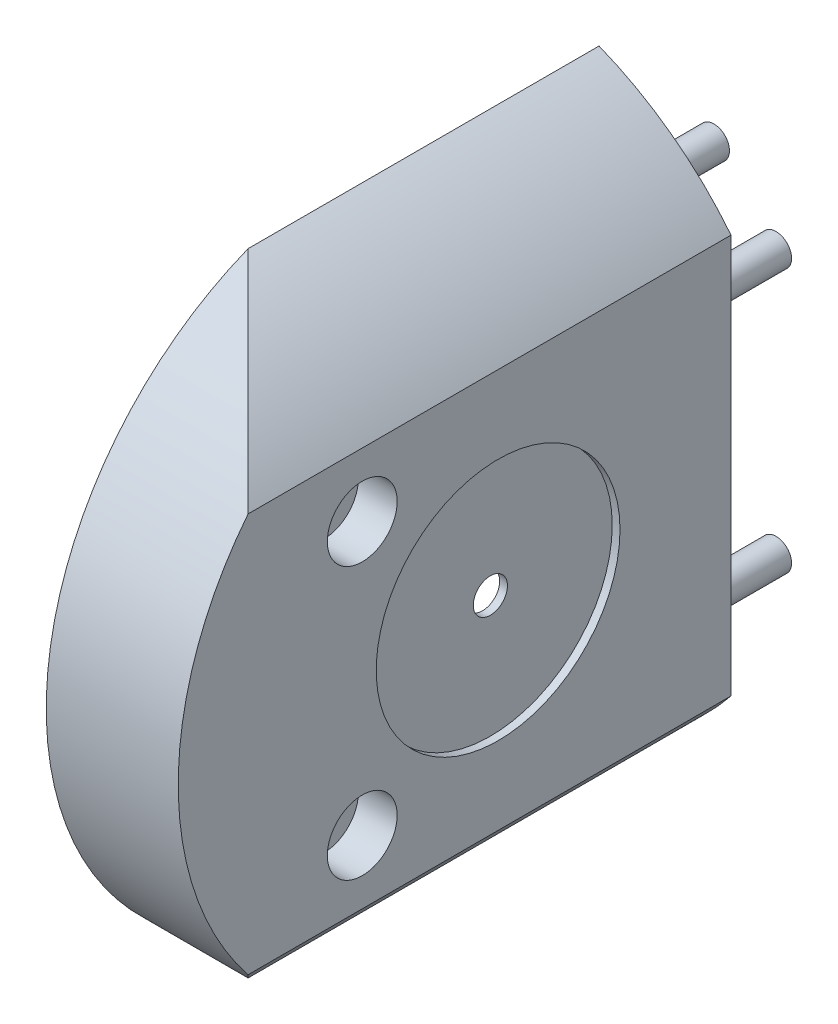
ISO-10303-21;
HEADER;
FILE_DESCRIPTION(('STEP AP214'),'2;1');
FILE_NAME('part.step','',(''),(''),'','','');
FILE_SCHEMA(('AUTOMOTIVE_DESIGN { 1 0 10303 214 1 1 1 1 }'));
ENDSEC;
DATA;
#1=APPLICATION_CONTEXT('core data for automotive mechanical design processes');
#2=APPLICATION_PROTOCOL_DEFINITION('international standard','automotive_design',2000,#1);
#3=PRODUCT_CONTEXT('',#1,'mechanical');
#4=PRODUCT('Part','Part','',(#3));
#5=PRODUCT_RELATED_PRODUCT_CATEGORY('part','',(#4));
#6=PRODUCT_DEFINITION_FORMATION('','',#4);
#7=PRODUCT_DEFINITION_CONTEXT('part definition',#1,'design');
#8=PRODUCT_DEFINITION('design','',#6,#7);
#9=PRODUCT_DEFINITION_SHAPE('','',#8);
#10=(LENGTH_UNIT() NAMED_UNIT(*) SI_UNIT(.MILLI.,.METRE.));
#11=(NAMED_UNIT(*) PLANE_ANGLE_UNIT() SI_UNIT($,.RADIAN.));
#12=(NAMED_UNIT(*) SI_UNIT($,.STERADIAN.) SOLID_ANGLE_UNIT());
#13=UNCERTAINTY_MEASURE_WITH_UNIT(LENGTH_MEASURE(1.E-05),#10,'distance_accuracy_value','');
#14=(GEOMETRIC_REPRESENTATION_CONTEXT(3) GLOBAL_UNCERTAINTY_ASSIGNED_CONTEXT((#13)) GLOBAL_UNIT_ASSIGNED_CONTEXT((#10,
#11,#12)) REPRESENTATION_CONTEXT('',''));
#15=CARTESIAN_POINT('',(0.,0.,0.));
#16=DIRECTION('',(0.,0.,1.));
#17=DIRECTION('',(1.,0.,0.));
#18=AXIS2_PLACEMENT_3D('',#15,#16,#17);
#19=CARTESIAN_POINT('',(15.2,41.2,30.));
#20=DIRECTION('',(1.,0.,0.));
#21=DIRECTION('',(0.,1.,0.));
#22=AXIS2_PLACEMENT_3D('',#19,#20,#21);
#23=PLANE('',#22);
#24=CARTESIAN_POINT('',(15.2,17.5,47.5));
#25=DIRECTION('',(1.,0.,0.));
#26=DIRECTION('',(0.,0.,-1.));
#27=AXIS2_PLACEMENT_3D('',#24,#25,#26);
#28=CIRCLE('',#27,2.);
#29=CARTESIAN_POINT('',(15.2,17.5,45.5));
#30=VERTEX_POINT('',#29);
#31=EDGE_CURVE('E228',#30,#30,#28,.T.);
#32=ORIENTED_EDGE('',*,*,#31,.T.);
#33=EDGE_LOOP('',(#32));
#34=FACE_BOUND('',#33,.T.);
#35=CARTESIAN_POINT('',(15.2,-17.5,47.5));
#36=DIRECTION('',(1.,0.,0.));
#37=DIRECTION('',(0.,0.,-1.));
#38=AXIS2_PLACEMENT_3D('',#35,#36,#37);
#39=CIRCLE('',#38,2.);
#40=CARTESIAN_POINT('',(15.2,-17.5,45.5));
#41=VERTEX_POINT('',#40);
#42=EDGE_CURVE('E231',#41,#41,#39,.T.);
#43=ORIENTED_EDGE('',*,*,#42,.T.);
#44=EDGE_LOOP('',(#43));
#45=FACE_BOUND('',#44,.T.);
#46=DIRECTION('',(0.,0.,-1.));
#47=VECTOR('',#46,1.);
#48=CARTESIAN_POINT('',(15.2,24.9319072675959,30.));
#49=LINE('',#48,#47);
#50=CARTESIAN_POINT('',(15.2,24.9319072675959,30.));
#51=VERTEX_POINT('',#50);
#52=CARTESIAN_POINT('',(15.2,24.9319072675959,0.));
#53=VERTEX_POINT('',#52);
#54=EDGE_CURVE('E232',#51,#53,#49,.T.);
#55=ORIENTED_EDGE('',*,*,#54,.F.);
#56=DIRECTION('',(0.,-1.,0.));
#57=VECTOR('',#56,1.);
#58=CARTESIAN_POINT('',(15.2,41.2,30.));
#59=LINE('',#58,#57);
#60=CARTESIAN_POINT('',(15.2,20.,30.));
#61=VERTEX_POINT('',#60);
#62=EDGE_CURVE('E111',#51,#61,#59,.T.);
#63=ORIENTED_EDGE('',*,*,#62,.T.);
#64=CARTESIAN_POINT('',(15.2,0.,30.));
#65=DIRECTION('',(-1.,0.,0.));
#66=DIRECTION('',(0.,-1.,0.));
#67=AXIS2_PLACEMENT_3D('',#64,#65,#66);
#68=CIRCLE('',#67,20.);
#69=CARTESIAN_POINT('',(15.2,-20.,30.));
#70=VERTEX_POINT('',#69);
#71=EDGE_CURVE('E116',#70,#61,#68,.T.);
#72=ORIENTED_EDGE('',*,*,#71,.F.);
#73=CARTESIAN_POINT('',(15.2,-24.9319072675959,30.));
#74=VERTEX_POINT('',#73);
#75=EDGE_CURVE('E49',#70,#74,#59,.T.);
#76=ORIENTED_EDGE('',*,*,#75,.T.);
#77=DIRECTION('',(0.,0.,-1.));
#78=VECTOR('',#77,1.);
#79=CARTESIAN_POINT('',(15.2,-24.9319072675959,30.));
#80=LINE('',#79,#78);
#81=CARTESIAN_POINT('',(15.2,-24.9319072675959,0.));
#82=VERTEX_POINT('',#81);
#83=EDGE_CURVE('E235',#82,#74,#80,.F.);
#84=ORIENTED_EDGE('',*,*,#83,.F.);
#85=DIRECTION('',(0.,-1.,0.));
#86=VECTOR('',#85,1.);
#87=CARTESIAN_POINT('',(15.2,41.2,0.));
#88=LINE('',#87,#86);
#89=CARTESIAN_POINT('',(15.2,-38.2936025988676,0.));
#90=VERTEX_POINT('',#89);
#91=EDGE_CURVE('E157',#82,#90,#88,.T.);
#92=ORIENTED_EDGE('',*,*,#91,.T.);
#93=DIRECTION('',(0.,0.,-1.));
#94=VECTOR('',#93,1.);
#95=CARTESIAN_POINT('',(15.2,-38.2936025988676,71.2));
#96=LINE('',#95,#94);
#97=CARTESIAN_POINT('',(15.2,-38.2936025988676,45.2));
#98=VERTEX_POINT('',#97);
#99=EDGE_CURVE('E144',#90,#98,#96,.F.);
#100=ORIENTED_EDGE('',*,*,#99,.T.);
#101=CARTESIAN_POINT('',(15.2,0.,30.));
#102=DIRECTION('',(-1.,0.,0.));
#103=DIRECTION('',(0.,-1.,0.));
#104=AXIS2_PLACEMENT_3D('',#101,#102,#103);
#105=CIRCLE('',#104,41.2);
#106=CARTESIAN_POINT('',(15.2,38.2936025988676,45.2));
#107=VERTEX_POINT('',#106);
#108=EDGE_CURVE('E153',#98,#107,#105,.T.);
#109=ORIENTED_EDGE('',*,*,#108,.T.);
#110=DIRECTION('',(0.,0.,-1.));
#111=VECTOR('',#110,1.);
#112=CARTESIAN_POINT('',(15.2,38.2936025988676,71.2));
#113=LINE('',#112,#111);
#114=CARTESIAN_POINT('',(15.2,38.2936025988676,0.));
#115=VERTEX_POINT('',#114);
#116=EDGE_CURVE('E150',#107,#115,#113,.T.);
#117=ORIENTED_EDGE('',*,*,#116,.T.);
#118=EDGE_CURVE('E160',#115,#53,#88,.T.);
#119=ORIENTED_EDGE('',*,*,#118,.T.);
#120=EDGE_LOOP('',(#55,#63,#72,#76,#84,#92,#100,#109,#117,#119));
#121=FACE_BOUND('',#120,.T.);
#122=ADVANCED_FACE('F35',(#34,#45,#121),#23,.F.);
#123=CARTESIAN_POINT('',(0.,0.,0.));
#124=DIRECTION('',(0.,0.,-1.));
#125=DIRECTION('',(-1.,0.,0.));
#126=AXIS2_PLACEMENT_3D('',#123,#124,#125);
#127=PLANE('',#126);
#128=CARTESIAN_POINT('',(28.,-17.,0.));
#129=DIRECTION('',(0.,0.,-1.));
#130=DIRECTION('',(-1.,0.,0.));
#131=AXIS2_PLACEMENT_3D('',#128,#129,#130);
#132=CIRCLE('',#131,2.);
#133=CARTESIAN_POINT('',(26.,-17.,0.));
#134=VERTEX_POINT('',#133);
#135=EDGE_CURVE('E178',#134,#134,#132,.T.);
#136=ORIENTED_EDGE('',*,*,#135,.F.);
#137=EDGE_LOOP('',(#136));
#138=FACE_BOUND('',#137,.T.);
#139=CARTESIAN_POINT('',(20.,-25.,0.));
#140=DIRECTION('',(0.,0.,-1.));
#141=DIRECTION('',(-1.,0.,0.));
#142=AXIS2_PLACEMENT_3D('',#139,#140,#141);
#143=CIRCLE('',#142,2.00000000000001);
#144=CARTESIAN_POINT('',(18.,-25.,0.));
#145=VERTEX_POINT('',#144);
#146=EDGE_CURVE('E175',#145,#145,#143,.T.);
#147=ORIENTED_EDGE('',*,*,#146,.F.);
#148=EDGE_LOOP('',(#147));
#149=FACE_BOUND('',#148,.T.);
#150=CARTESIAN_POINT('',(28.,17.,0.));
#151=DIRECTION('',(0.,0.,-1.));
#152=DIRECTION('',(-1.,0.,0.));
#153=AXIS2_PLACEMENT_3D('',#150,#151,#152);
#154=CIRCLE('',#153,2.);
#155=CARTESIAN_POINT('',(26.,17.,0.));
#156=VERTEX_POINT('',#155);
#157=EDGE_CURVE('E172',#156,#156,#154,.T.);
#158=ORIENTED_EDGE('',*,*,#157,.F.);
#159=EDGE_LOOP('',(#158));
#160=FACE_BOUND('',#159,.T.);
#161=CARTESIAN_POINT('',(20.,25.,0.));
#162=DIRECTION('',(0.,0.,-1.));
#163=DIRECTION('',(-1.,0.,0.));
#164=AXIS2_PLACEMENT_3D('',#161,#162,#163);
#165=CIRCLE('',#164,2.00000000000001);
#166=CARTESIAN_POINT('',(18.,25.,0.));
#167=VERTEX_POINT('',#166);
#168=EDGE_CURVE('E169',#167,#167,#165,.T.);
#169=ORIENTED_EDGE('',*,*,#168,.F.);
#170=EDGE_LOOP('',(#169));
#171=FACE_BOUND('',#170,.T.);
#172=ORIENTED_EDGE('',*,*,#91,.F.);
#173=CARTESIAN_POINT('',(0.,0.,0.));
#174=DIRECTION('',(0.,0.,1.));
#175=DIRECTION('',(1.,0.,0.));
#176=AXIS2_PLACEMENT_3D('',#173,#174,#175);
#177=CIRCLE('',#176,29.2);
#178=EDGE_CURVE('E441',#82,#53,#177,.T.);
#179=ORIENTED_EDGE('',*,*,#178,.T.);
#180=ORIENTED_EDGE('',*,*,#118,.F.);
#181=CARTESIAN_POINT('',(0.,0.,0.));
#182=DIRECTION('',(0.,0.,1.));
#183=DIRECTION('',(1.,0.,0.));
#184=AXIS2_PLACEMENT_3D('',#181,#182,#183);
#185=CIRCLE('',#184,41.2);
#186=CARTESIAN_POINT('',(32.2,25.7021399887247,0.));
#187=VERTEX_POINT('',#186);
#188=EDGE_CURVE('E141',#187,#115,#185,.T.);
#189=ORIENTED_EDGE('',*,*,#188,.F.);
#190=DIRECTION('',(0.,1.,0.));
#191=VECTOR('',#190,1.);
#192=CARTESIAN_POINT('',(32.2,41.2,0.));
#193=LINE('',#192,#191);
#194=CARTESIAN_POINT('',(32.2,-25.7021399887247,0.));
#195=VERTEX_POINT('',#194);
#196=EDGE_CURVE('E163',#195,#187,#193,.T.);
#197=ORIENTED_EDGE('',*,*,#196,.F.);
#198=EDGE_CURVE('E140',#90,#195,#185,.T.);
#199=ORIENTED_EDGE('',*,*,#198,.F.);
#200=EDGE_LOOP('',(#172,#179,#180,#189,#197,#199));
#201=FACE_BOUND('',#200,.T.);
#202=ADVANCED_FACE('F217',(#138,#149,#160,#171,#201),#127,.T.);
#203=CARTESIAN_POINT('',(32.2,41.2,30.));
#204=DIRECTION('',(-1.,0.,0.));
#205=DIRECTION('',(0.,0.,1.));
#206=AXIS2_PLACEMENT_3D('',#203,#204,#205);
#207=PLANE('',#206);
#208=CARTESIAN_POINT('',(32.2,-17.5,47.5));
#209=DIRECTION('',(1.,0.,0.));
#210=DIRECTION('',(0.,0.,-1.));
#211=AXIS2_PLACEMENT_3D('',#208,#209,#210);
#212=CIRCLE('',#211,4.5);
#213=CARTESIAN_POINT('',(32.2,-17.5,43.));
#214=VERTEX_POINT('',#213);
#215=EDGE_CURVE('E442',#214,#214,#212,.T.);
#216=ORIENTED_EDGE('',*,*,#215,.F.);
#217=EDGE_LOOP('',(#216));
#218=FACE_BOUND('',#217,.T.);
#219=CARTESIAN_POINT('',(32.2,17.5,47.5));
#220=DIRECTION('',(1.,0.,0.));
#221=DIRECTION('',(0.,0.,-1.));
#222=AXIS2_PLACEMENT_3D('',#219,#220,#221);
#223=CIRCLE('',#222,4.5);
#224=CARTESIAN_POINT('',(32.2,17.5,43.));
#225=VERTEX_POINT('',#224);
#226=EDGE_CURVE('E431',#225,#225,#223,.T.);
#227=ORIENTED_EDGE('',*,*,#226,.F.);
#228=EDGE_LOOP('',(#227));
#229=FACE_BOUND('',#228,.T.);
#230=CARTESIAN_POINT('',(32.2,0.,30.));
#231=DIRECTION('',(1.,0.,0.));
#232=DIRECTION('',(0.,0.,-1.));
#233=AXIS2_PLACEMENT_3D('',#230,#231,#232);
#234=CIRCLE('',#233,15.7);
#235=CARTESIAN_POINT('',(32.2,0.,14.3));
#236=VERTEX_POINT('',#235);
#237=EDGE_CURVE('E125',#236,#236,#234,.T.);
#238=ORIENTED_EDGE('',*,*,#237,.F.);
#239=EDGE_LOOP('',(#238));
#240=FACE_BOUND('',#239,.T.);
#241=ORIENTED_EDGE('',*,*,#196,.T.);
#242=DIRECTION('',(0.,0.,-1.));
#243=VECTOR('',#242,1.);
#244=CARTESIAN_POINT('',(32.2,25.7021399887247,71.2));
#245=LINE('',#244,#243);
#246=CARTESIAN_POINT('',(32.2,25.7021399887247,62.2));
#247=VERTEX_POINT('',#246);
#248=EDGE_CURVE('E147',#187,#247,#245,.F.);
#249=ORIENTED_EDGE('',*,*,#248,.T.);
#250=CARTESIAN_POINT('',(32.2,0.,30.));
#251=DIRECTION('',(-1.,0.,0.));
#252=DIRECTION('',(0.,-1.,0.));
#253=AXIS2_PLACEMENT_3D('',#250,#251,#252);
#254=CIRCLE('',#253,41.2);
#255=CARTESIAN_POINT('',(32.2,-25.7021399887246,62.2));
#256=VERTEX_POINT('',#255);
#257=EDGE_CURVE('E154',#256,#247,#254,.T.);
#258=ORIENTED_EDGE('',*,*,#257,.F.);
#259=DIRECTION('',(0.,0.,-1.));
#260=VECTOR('',#259,1.);
#261=CARTESIAN_POINT('',(32.2,-25.7021399887247,71.2));
#262=LINE('',#261,#260);
#263=EDGE_CURVE('E57',#256,#195,#262,.T.);
#264=ORIENTED_EDGE('',*,*,#263,.T.);
#265=EDGE_LOOP('',(#241,#249,#258,#264));
#266=FACE_BOUND('',#265,.T.);
#267=ADVANCED_FACE('F222',(#218,#229,#240,#266),#207,.F.);
#268=CARTESIAN_POINT('',(32.2,0.,30.));
#269=DIRECTION('',(-1.,0.,0.));
#270=DIRECTION('',(0.,-1.,0.));
#271=AXIS2_PLACEMENT_3D('',#268,#269,#270);
#272=CYLINDRICAL_SURFACE('',#271,41.2);
#273=CARTESIAN_POINT('',(0.,0.,30.));
#274=DIRECTION('',(-0.707106781186547,0.,0.707106781186547));
#275=DIRECTION('',(-0.707106781186547,0.,-0.707106781186547));
#276=AXIS2_PLACEMENT_3D('',#273,#274,#275);
#277=ELLIPSE('',#276,58.2655987697715,41.2);
#278=EDGE_CURVE('E168',#107,#247,#277,.F.);
#279=ORIENTED_EDGE('',*,*,#278,.F.);
#280=ORIENTED_EDGE('',*,*,#108,.F.);
#281=EDGE_CURVE('E166',#256,#98,#277,.F.);
#282=ORIENTED_EDGE('',*,*,#281,.F.);
#283=ORIENTED_EDGE('',*,*,#257,.T.);
#284=EDGE_LOOP('',(#279,#280,#282,#283));
#285=FACE_BOUND('',#284,.T.);
#286=ADVANCED_FACE('F251',(#285),#272,.T.);
#287=CARTESIAN_POINT('',(0.,0.,71.2));
#288=DIRECTION('',(0.,0.,-1.));
#289=DIRECTION('',(-1.,0.,0.));
#290=AXIS2_PLACEMENT_3D('',#287,#288,#289);
#291=CYLINDRICAL_SURFACE('',#290,41.2);
#292=ORIENTED_EDGE('',*,*,#198,.T.);
#293=ORIENTED_EDGE('',*,*,#263,.F.);
#294=ORIENTED_EDGE('',*,*,#281,.T.);
#295=ORIENTED_EDGE('',*,*,#99,.F.);
#296=EDGE_LOOP('',(#292,#293,#294,#295));
#297=FACE_BOUND('',#296,.T.);
#298=ADVANCED_FACE('F265',(#297),#291,.T.);
#299=ORIENTED_EDGE('',*,*,#278,.T.);
#300=ORIENTED_EDGE('',*,*,#248,.F.);
#301=ORIENTED_EDGE('',*,*,#188,.T.);
#302=ORIENTED_EDGE('',*,*,#116,.F.);
#303=EDGE_LOOP('',(#299,#300,#301,#302));
#304=FACE_BOUND('',#303,.T.);
#305=ADVANCED_FACE('F260',(#304),#291,.T.);
#306=CARTESIAN_POINT('',(20.,25.,-10.));
#307=DIRECTION('',(0.,0.,1.));
#308=DIRECTION('',(1.,0.,0.));
#309=AXIS2_PLACEMENT_3D('',#306,#307,#308);
#310=CYLINDRICAL_SURFACE('',#309,2.00000000000001);
#311=CARTESIAN_POINT('',(20.,25.,-10.));
#312=DIRECTION('',(0.,0.,1.));
#313=DIRECTION('',(1.,0.,0.));
#314=AXIS2_PLACEMENT_3D('',#311,#312,#313);
#315=CIRCLE('',#314,2.00000000000001);
#316=CARTESIAN_POINT('',(22.,25.,-10.));
#317=VERTEX_POINT('',#316);
#318=EDGE_CURVE('E137',#317,#317,#315,.T.);
#319=ORIENTED_EDGE('',*,*,#318,.T.);
#320=EDGE_LOOP('',(#319));
#321=FACE_BOUND('',#320,.T.);
#322=ORIENTED_EDGE('',*,*,#168,.T.);
#323=EDGE_LOOP('',(#322));
#324=FACE_BOUND('',#323,.T.);
#325=ADVANCED_FACE('F272',(#321,#324),#310,.T.);
#326=CARTESIAN_POINT('',(20.,25.,-10.));
#327=DIRECTION('',(0.,0.,1.));
#328=DIRECTION('',(1.,0.,0.));
#329=AXIS2_PLACEMENT_3D('',#326,#327,#328);
#330=PLANE('',#329);
#331=ORIENTED_EDGE('',*,*,#318,.F.);
#332=EDGE_LOOP('',(#331));
#333=FACE_BOUND('',#332,.T.);
#334=ADVANCED_FACE('F277',(#333),#330,.F.);
#335=CARTESIAN_POINT('',(28.,17.,-10.));
#336=DIRECTION('',(0.,0.,1.));
#337=DIRECTION('',(1.,0.,0.));
#338=AXIS2_PLACEMENT_3D('',#335,#336,#337);
#339=CYLINDRICAL_SURFACE('',#338,2.);
#340=CARTESIAN_POINT('',(28.,17.,-10.));
#341=DIRECTION('',(0.,0.,1.));
#342=DIRECTION('',(1.,0.,0.));
#343=AXIS2_PLACEMENT_3D('',#340,#341,#342);
#344=CIRCLE('',#343,2.);
#345=CARTESIAN_POINT('',(30.,17.,-10.));
#346=VERTEX_POINT('',#345);
#347=EDGE_CURVE('E134',#346,#346,#344,.T.);
#348=ORIENTED_EDGE('',*,*,#347,.T.);
#349=EDGE_LOOP('',(#348));
#350=FACE_BOUND('',#349,.T.);
#351=ORIENTED_EDGE('',*,*,#157,.T.);
#352=EDGE_LOOP('',(#351));
#353=FACE_BOUND('',#352,.T.);
#354=ADVANCED_FACE('F281',(#350,#353),#339,.T.);
#355=CARTESIAN_POINT('',(28.,17.,-10.));
#356=DIRECTION('',(0.,0.,1.));
#357=DIRECTION('',(1.,0.,0.));
#358=AXIS2_PLACEMENT_3D('',#355,#356,#357);
#359=PLANE('',#358);
#360=ORIENTED_EDGE('',*,*,#347,.F.);
#361=EDGE_LOOP('',(#360));
#362=FACE_BOUND('',#361,.T.);
#363=ADVANCED_FACE('F285',(#362),#359,.F.);
#364=CARTESIAN_POINT('',(20.,-25.,-10.));
#365=DIRECTION('',(0.,0.,1.));
#366=DIRECTION('',(1.,0.,0.));
#367=AXIS2_PLACEMENT_3D('',#364,#365,#366);
#368=CYLINDRICAL_SURFACE('',#367,2.00000000000001);
#369=CARTESIAN_POINT('',(20.,-25.,-10.));
#370=DIRECTION('',(0.,0.,1.));
#371=DIRECTION('',(1.,0.,0.));
#372=AXIS2_PLACEMENT_3D('',#369,#370,#371);
#373=CIRCLE('',#372,2.00000000000001);
#374=CARTESIAN_POINT('',(22.,-25.,-10.));
#375=VERTEX_POINT('',#374);
#376=EDGE_CURVE('E131',#375,#375,#373,.T.);
#377=ORIENTED_EDGE('',*,*,#376,.T.);
#378=EDGE_LOOP('',(#377));
#379=FACE_BOUND('',#378,.T.);
#380=ORIENTED_EDGE('',*,*,#146,.T.);
#381=EDGE_LOOP('',(#380));
#382=FACE_BOUND('',#381,.T.);
#383=ADVANCED_FACE('F289',(#379,#382),#368,.T.);
#384=CARTESIAN_POINT('',(20.,-25.,-10.));
#385=DIRECTION('',(0.,0.,1.));
#386=DIRECTION('',(1.,0.,0.));
#387=AXIS2_PLACEMENT_3D('',#384,#385,#386);
#388=PLANE('',#387);
#389=ORIENTED_EDGE('',*,*,#376,.F.);
#390=EDGE_LOOP('',(#389));
#391=FACE_BOUND('',#390,.T.);
#392=ADVANCED_FACE('F293',(#391),#388,.F.);
#393=CARTESIAN_POINT('',(28.,-17.,-10.));
#394=DIRECTION('',(0.,0.,1.));
#395=DIRECTION('',(1.,0.,0.));
#396=AXIS2_PLACEMENT_3D('',#393,#394,#395);
#397=CYLINDRICAL_SURFACE('',#396,2.);
#398=CARTESIAN_POINT('',(28.,-17.,-10.));
#399=DIRECTION('',(0.,0.,1.));
#400=DIRECTION('',(1.,0.,0.));
#401=AXIS2_PLACEMENT_3D('',#398,#399,#400);
#402=CIRCLE('',#401,2.);
#403=CARTESIAN_POINT('',(30.,-17.,-10.));
#404=VERTEX_POINT('',#403);
#405=EDGE_CURVE('E122',#404,#404,#402,.T.);
#406=ORIENTED_EDGE('',*,*,#405,.T.);
#407=EDGE_LOOP('',(#406));
#408=FACE_BOUND('',#407,.T.);
#409=ORIENTED_EDGE('',*,*,#135,.T.);
#410=EDGE_LOOP('',(#409));
#411=FACE_BOUND('',#410,.T.);
#412=ADVANCED_FACE('F297',(#408,#411),#397,.T.);
#413=CARTESIAN_POINT('',(28.,-17.,-10.));
#414=DIRECTION('',(0.,0.,1.));
#415=DIRECTION('',(1.,0.,0.));
#416=AXIS2_PLACEMENT_3D('',#413,#414,#415);
#417=PLANE('',#416);
#418=ORIENTED_EDGE('',*,*,#405,.F.);
#419=EDGE_LOOP('',(#418));
#420=FACE_BOUND('',#419,.T.);
#421=ADVANCED_FACE('F212',(#420),#417,.F.);
#422=CARTESIAN_POINT('',(30.2,0.,30.));
#423=DIRECTION('',(-1.,0.,0.));
#424=DIRECTION('',(0.,-1.,0.));
#425=AXIS2_PLACEMENT_3D('',#422,#423,#424);
#426=CYLINDRICAL_SURFACE('',#425,20.);
#427=CARTESIAN_POINT('',(30.2,0.,30.));
#428=DIRECTION('',(-1.,0.,0.));
#429=DIRECTION('',(0.,-1.,0.));
#430=AXIS2_PLACEMENT_3D('',#427,#428,#429);
#431=CIRCLE('',#430,20.);
#432=CARTESIAN_POINT('',(30.2,-20.,30.));
#433=VERTEX_POINT('',#432);
#434=EDGE_CURVE('E118',#433,#433,#431,.T.);
#435=ORIENTED_EDGE('',*,*,#434,.F.);
#436=EDGE_LOOP('',(#435));
#437=FACE_BOUND('',#436,.T.);
#438=ORIENTED_EDGE('',*,*,#71,.T.);
#439=DIRECTION('',(-1.,0.,0.));
#440=VECTOR('',#439,1.);
#441=CARTESIAN_POINT('',(30.2,20.,30.));
#442=LINE('',#441,#440);
#443=CARTESIAN_POINT('',(21.2753378351555,20.,30.));
#444=VERTEX_POINT('',#443);
#445=EDGE_CURVE('E12',#61,#444,#442,.F.);
#446=ORIENTED_EDGE('',*,*,#445,.T.);
#447=CARTESIAN_POINT('',(21.2753378351555,-20.,30.));
#448=CARTESIAN_POINT('',(21.2753184302722,-20.0000089862144,29.756306849058));
#449=CARTESIAN_POINT('',(21.2795243370229,-19.9955462529341,29.5126215474343));
#450=CARTESIAN_POINT('',(21.2962429183518,-19.9777453635352,29.0258869656154));
#451=CARTESIAN_POINT('',(21.3087546712133,-19.9644081922304,28.7828376178514));
#452=CARTESIAN_POINT('',(21.3419172790187,-19.9289519355064,28.2982896902568));
#453=CARTESIAN_POINT('',(21.3625563998975,-19.9068455105514,28.0567893825762));
#454=CARTESIAN_POINT('',(21.4116927159131,-19.8539846189691,27.5755582259683));
#455=CARTESIAN_POINT('',(21.440190060115,-19.8232299882913,27.3358274106955));
#456=CARTESIAN_POINT('',(21.5362865688457,-19.7189596650981,26.6250708704396));
#457=CARTESIAN_POINT('',(21.6148618820326,-19.6330485159267,26.157254159057));
#458=CARTESIAN_POINT('',(21.7979764745618,-19.4295354455889,25.2337659709322));
#459=CARTESIAN_POINT('',(21.9025241366961,-19.3119232916156,24.778098468131));
#460=CARTESIAN_POINT('',(22.1328123665742,-19.047549338701,23.8838740694589));
#461=CARTESIAN_POINT('',(22.2584278467392,-18.9009587279116,23.4452339741327));
#462=CARTESIAN_POINT('',(22.5271169971071,-18.5799026965083,22.5839025277225));
#463=CARTESIAN_POINT('',(22.6701896452934,-18.4054389075235,22.161210244881));
#464=CARTESIAN_POINT('',(22.970244700127,-18.0295820629911,21.3315413894169));
#465=CARTESIAN_POINT('',(23.1272653735763,-17.8281140997473,20.9246127439687));
#466=CARTESIAN_POINT('',(23.4511609707706,-17.3998605693943,20.1283610851443));
#467=CARTESIAN_POINT('',(23.6180372436429,-17.1730715322969,19.7390404950648));
#468=CARTESIAN_POINT('',(23.9862498236408,-16.6558240044548,18.9159061719393));
#469=CARTESIAN_POINT('',(24.1887349679465,-16.361031070487,18.4853252847479));
#470=CARTESIAN_POINT('',(24.5975438317732,-15.7397321742517,17.6496165944029));
#471=CARTESIAN_POINT('',(24.8038678223753,-15.4132239654771,17.2444905976631));
#472=CARTESIAN_POINT('',(25.2159957859237,-14.729324775936,16.4605145288305));
#473=CARTESIAN_POINT('',(25.4217994728373,-14.371919521948,16.0816767481134));
#474=CARTESIAN_POINT('',(25.8286398392478,-13.6272317210495,15.3517776141053));
#475=CARTESIAN_POINT('',(26.0296762101608,-13.2399472469491,15.0007180554546));
#476=CARTESIAN_POINT('',(26.4539227937002,-12.373266743432,14.2751869714212));
#477=CARTESIAN_POINT('',(26.675659660424,-11.888954866074,13.9056915365574));
#478=CARTESIAN_POINT('',(27.1015417210391,-10.8832345680754,13.2092451610197));
#479=CARTESIAN_POINT('',(27.3056838530727,-10.3618197194358,12.8823016202503));
#480=CARTESIAN_POINT('',(27.6903355839843,-9.28500821100445,12.2751646890592));
#481=CARTESIAN_POINT('',(27.8708787574495,-8.72966151549079,11.9949047218722));
#482=CARTESIAN_POINT('',(28.1199642325182,-7.87375686729981,11.6124586848078));
#483=CARTESIAN_POINT('',(28.1993644924187,-7.58467052534531,11.4913106233965));
#484=CARTESIAN_POINT('',(28.3503409807865,-6.9992525025845,11.2620896779501));
#485=CARTESIAN_POINT('',(28.4219152605828,-6.70291903961841,11.1540200497359));
#486=CARTESIAN_POINT('',(28.5889078163792,-5.9599274100655,10.9029267277919));
#487=CARTESIAN_POINT('',(28.6792922020035,-5.50935362117456,10.7680063773739));
#488=CARTESIAN_POINT('',(28.8396753998984,-4.59650438374325,10.5296470014167));
#489=CARTESIAN_POINT('',(28.9096783575648,-4.13423133554394,10.4262015739733));
#490=CARTESIAN_POINT('',(29.0278176752585,-3.20106372686036,10.2521320509005));
#491=CARTESIAN_POINT('',(29.0759676235427,-2.73017471384814,10.1814875589343));
#492=CARTESIAN_POINT('',(29.1493995349379,-1.78276437947126,10.0739105341411));
#493=CARTESIAN_POINT('',(29.1746807354574,-1.30624287081963,10.0369791255253));
#494=CARTESIAN_POINT('',(29.2018214029233,-0.350259096103404,9.99733556920352));
#495=CARTESIAN_POINT('',(29.203639285547,0.129206884800119,9.99468417637075));
#496=CARTESIAN_POINT('',(29.1837037557593,1.08659432296098,10.0237972503787));
#497=CARTESIAN_POINT('',(29.1619504308778,1.56451578594717,10.055561589419));
#498=CARTESIAN_POINT('',(29.0953632855686,2.51536150082176,10.1530498774968));
#499=CARTESIAN_POINT('',(29.0505238260817,2.98828450296158,10.2187821236082));
#500=CARTESIAN_POINT('',(28.9387609023513,3.9256764952821,10.3832846397984));
#501=CARTESIAN_POINT('',(28.8718373785993,4.39014546267872,10.4820549989028));
#502=CARTESIAN_POINT('',(28.7188604610407,5.29859051010246,10.7090738400857));
#503=CARTESIAN_POINT('',(28.6332100696267,5.74279006150739,10.8367030082762));
#504=CARTESIAN_POINT('',(28.443724836462,6.61777229324003,11.1209981879722));
#505=CARTESIAN_POINT('',(28.3398903573681,7.04855524094177,11.2776636203928));
#506=CARTESIAN_POINT('',(28.1159199983751,7.89472007201601,11.6184481338802));
#507=CARTESIAN_POINT('',(27.9957838976607,8.31010174667192,11.8025675868318));
#508=CARTESIAN_POINT('',(27.7412370211972,9.12390235751948,12.1966615754816));
#509=CARTESIAN_POINT('',(27.6068243624967,9.52231904644787,12.4066395222699));
#510=CARTESIAN_POINT('',(27.3100416953445,10.3447388106282,12.8758928614666));
#511=CARTESIAN_POINT('',(27.1462278165282,10.7665731115476,13.1380568350806));
#512=CARTESIAN_POINT('',(26.8066009606742,11.586329763565,13.6904534024271));
#513=CARTESIAN_POINT('',(26.6307872145432,11.9842505789252,13.9806877957417));
#514=CARTESIAN_POINT('',(26.2700749460308,12.7555712245076,14.5877799882765));
#515=CARTESIAN_POINT('',(26.085167453887,13.1289459595246,14.9046643019899));
#516=CARTESIAN_POINT('',(25.7096091921239,13.8499552819177,15.5633380037969));
#517=CARTESIAN_POINT('',(25.5189579859478,14.1975879057593,15.9051292877856));
#518=CARTESIAN_POINT('',(25.1022206197154,14.9238928976429,16.6732303076163));
#519=CARTESIAN_POINT('',(24.8756758518339,15.2976315514693,17.1039700704451));
#520=CARTESIAN_POINT('',(24.4248523160603,16.0076063873161,17.9965906261624));
#521=CARTESIAN_POINT('',(24.2005740330767,16.3438346923636,18.4584779273168));
#522=CARTESIAN_POINT('',(23.7605637458344,16.9771686382632,19.4121132002709));
#523=CARTESIAN_POINT('',(23.5448304789825,17.27428007413,19.9038567331766));
#524=CARTESIAN_POINT('',(23.1288640502771,17.8273757134403,20.9161077849333));
#525=CARTESIAN_POINT('',(22.928625491765,18.0833742698183,21.4366051798503));
#526=CARTESIAN_POINT('',(22.597654932739,18.494257876085,22.3739762952488));
#527=CARTESIAN_POINT('',(22.4619165300749,18.6585465423684,22.7849770518309));
#528=CARTESIAN_POINT('',(22.2073015884361,18.9608760035355,23.6216772483663));
#529=CARTESIAN_POINT('',(22.0884247983087,19.0989171893842,24.0473764692695));
#530=CARTESIAN_POINT('',(21.8716097865775,19.3468284689775,24.9106742898561));
#531=CARTESIAN_POINT('',(21.7736082826069,19.456783911043,25.3482322590968));
#532=CARTESIAN_POINT('',(21.6016873301505,19.6474835106808,26.2341511279326));
#533=CARTESIAN_POINT('',(21.5277576002775,19.7282401411009,26.6825073273438));
#534=CARTESIAN_POINT('',(21.4045318799096,19.8618917570281,27.6059439083571));
#535=CARTESIAN_POINT('',(21.3563680118295,19.9135110636512,28.081366991567));
#536=CARTESIAN_POINT('',(21.3079038079038,19.9653130146934,28.7983411157021));
#537=CARTESIAN_POINT('',(21.2957123759247,19.9783093102664,29.0382694441659));
#538=CARTESIAN_POINT('',(21.2794223039242,19.9956560544434,29.5187845990855));
#539=CARTESIAN_POINT('',(21.275326110244,20.0000038895278,29.7593716026017));
#540=CARTESIAN_POINT('',(21.2753378351555,20.,30.));
#541=B_SPLINE_CURVE_WITH_KNOTS('',3,(#447,#448,#449,#450,#451,#452,#453,#454,#455,#456,#457,
#458,#459,#460,#461,#462,#463,#464,#465,#466,#467,#468,#469,#470,#471,#472,#473,#474,#475,#476,
#477,#478,#479,#480,#481,#482,#483,#484,#485,#486,#487,#488,#489,#490,#491,#492,#493,#494,#495,
#496,#497,#498,#499,#500,#501,#502,#503,#504,#505,#506,#507,#508,#509,#510,#511,#512,#513,#514,
#515,#516,#517,#518,#519,#520,#521,#522,#523,#524,#525,#526,#527,#528,#529,#530,#531,#532,#533,
#534,#535,#536,#537,#538,#539,#540),.UNSPECIFIED.,.F.,.F.,(4,2,2,2,2,2,2,2,2,2,2,2,2,2,2,2,2,2,
2,2,2,2,2,2,2,2,2,2,2,2,2,2,2,2,2,2,2,2,2,2,2,2,2,2,2,2,4),(0.,0.730988940395238,
1.46189677502962,2.1917531919217,2.92162345462911,4.36566525479033,5.81017373838558,
7.24639102027746,8.68252426024034,10.122727024053,11.5631273953855,13.2407637912754,
14.9185191069674,16.5970536643685,18.2756965768011,20.2178574657896,22.1603556524857,
24.1000594193208,25.0697221907631,26.039625861252,27.4748301483178,28.9097423237266,
30.3437610405547,31.7778275750491,33.2144353747557,34.6510378397434,36.0879913783247,
37.524948789,38.9335868103937,40.3421967416275,41.7508257552379,43.1596407857806,
44.7270526197546,46.2945650064988,47.8636558201429,49.4328661965072,51.2717712920341,
53.1110618238071,54.9500795643646,56.7884538824503,58.176209161769,59.5639437683921,
60.9474096954233,62.3302839475599,63.7697597647169,64.4912721130958,65.2130024656326),.UNSPECIFIED.);
#542=CARTESIAN_POINT('',(21.2753378351555,-20.,30.));
#543=VERTEX_POINT('',#542);
#544=EDGE_CURVE('E42',#543,#444,#541,.T.);
#545=ORIENTED_EDGE('',*,*,#544,.F.);
#546=DIRECTION('',(-1.,0.,0.));
#547=VECTOR('',#546,1.);
#548=CARTESIAN_POINT('',(30.2,-20.,30.));
#549=LINE('',#548,#547);
#550=EDGE_CURVE('E107',#543,#70,#549,.T.);
#551=ORIENTED_EDGE('',*,*,#550,.T.);
#552=EDGE_LOOP('',(#438,#446,#545,#551));
#553=FACE_BOUND('',#552,.T.);
#554=ADVANCED_FACE('F114',(#437,#553),#426,.F.);
#555=CARTESIAN_POINT('',(30.2,0.,30.));
#556=DIRECTION('',(-1.,0.,0.));
#557=DIRECTION('',(0.,-1.,0.));
#558=AXIS2_PLACEMENT_3D('',#555,#556,#557);
#559=PLANE('',#558);
#560=CARTESIAN_POINT('',(30.2,0.,30.));
#561=DIRECTION('',(1.,0.,0.));
#562=DIRECTION('',(0.,0.,-1.));
#563=AXIS2_PLACEMENT_3D('',#560,#561,#562);
#564=CIRCLE('',#563,2.2);
#565=CARTESIAN_POINT('',(30.2,0.,27.8));
#566=VERTEX_POINT('',#565);
#567=EDGE_CURVE('E242',#566,#566,#564,.T.);
#568=ORIENTED_EDGE('',*,*,#567,.T.);
#569=EDGE_LOOP('',(#568));
#570=FACE_BOUND('',#569,.T.);
#571=ORIENTED_EDGE('',*,*,#434,.T.);
#572=EDGE_LOOP('',(#571));
#573=FACE_BOUND('',#572,.T.);
#574=ADVANCED_FACE('F205',(#570,#573),#559,.T.);
#575=CARTESIAN_POINT('',(31.2,0.,30.));
#576=DIRECTION('',(1.,0.,0.));
#577=DIRECTION('',(0.,0.,-1.));
#578=AXIS2_PLACEMENT_3D('',#575,#576,#577);
#579=CYLINDRICAL_SURFACE('',#578,15.7);
#580=CARTESIAN_POINT('',(31.2,0.,30.));
#581=DIRECTION('',(1.,0.,0.));
#582=DIRECTION('',(0.,0.,-1.));
#583=AXIS2_PLACEMENT_3D('',#580,#581,#582);
#584=CIRCLE('',#583,15.7);
#585=CARTESIAN_POINT('',(31.2,0.,14.3));
#586=VERTEX_POINT('',#585);
#587=EDGE_CURVE('E119',#586,#586,#584,.T.);
#588=ORIENTED_EDGE('',*,*,#587,.F.);
#589=EDGE_LOOP('',(#588));
#590=FACE_BOUND('',#589,.T.);
#591=ORIENTED_EDGE('',*,*,#237,.T.);
#592=EDGE_LOOP('',(#591));
#593=FACE_BOUND('',#592,.T.);
#594=ADVANCED_FACE('F202',(#590,#593),#579,.F.);
#595=CARTESIAN_POINT('',(31.2,0.,30.));
#596=DIRECTION('',(1.,0.,0.));
#597=DIRECTION('',(0.,0.,-1.));
#598=AXIS2_PLACEMENT_3D('',#595,#596,#597);
#599=PLANE('',#598);
#600=CARTESIAN_POINT('',(31.2,0.,30.));
#601=DIRECTION('',(1.,0.,0.));
#602=DIRECTION('',(0.,0.,-1.));
#603=AXIS2_PLACEMENT_3D('',#600,#601,#602);
#604=CIRCLE('',#603,2.2);
#605=CARTESIAN_POINT('',(31.2,0.,27.8));
#606=VERTEX_POINT('',#605);
#607=EDGE_CURVE('E237',#606,#606,#604,.T.);
#608=ORIENTED_EDGE('',*,*,#607,.F.);
#609=EDGE_LOOP('',(#608));
#610=FACE_BOUND('',#609,.T.);
#611=ORIENTED_EDGE('',*,*,#587,.T.);
#612=EDGE_LOOP('',(#611));
#613=FACE_BOUND('',#612,.T.);
#614=ADVANCED_FACE('F198',(#610,#613),#599,.T.);
#615=CARTESIAN_POINT('',(30.2,0.,30.));
#616=DIRECTION('',(1.,0.,0.));
#617=DIRECTION('',(0.,0.,-1.));
#618=AXIS2_PLACEMENT_3D('',#615,#616,#617);
#619=CYLINDRICAL_SURFACE('',#618,2.2);
#620=ORIENTED_EDGE('',*,*,#567,.F.);
#621=EDGE_LOOP('',(#620));
#622=FACE_BOUND('',#621,.T.);
#623=ORIENTED_EDGE('',*,*,#607,.T.);
#624=EDGE_LOOP('',(#623));
#625=FACE_BOUND('',#624,.T.);
#626=ADVANCED_FACE('F194',(#622,#625),#619,.F.);
#627=CARTESIAN_POINT('',(0.,0.,30.));
#628=DIRECTION('',(0.,0.,-1.));
#629=DIRECTION('',(-1.,0.,0.));
#630=AXIS2_PLACEMENT_3D('',#627,#628,#629);
#631=CYLINDRICAL_SURFACE('',#630,29.2);
#632=ORIENTED_EDGE('',*,*,#83,.T.);
#633=CARTESIAN_POINT('',(0.,0.,30.));
#634=DIRECTION('',(0.,0.,1.));
#635=DIRECTION('',(1.,0.,0.));
#636=AXIS2_PLACEMENT_3D('',#633,#634,#635);
#637=CIRCLE('',#636,29.2);
#638=EDGE_CURVE('E105',#74,#543,#637,.T.);
#639=ORIENTED_EDGE('',*,*,#638,.T.);
#640=ORIENTED_EDGE('',*,*,#544,.T.);
#641=EDGE_CURVE('E103',#444,#51,#637,.T.);
#642=ORIENTED_EDGE('',*,*,#641,.T.);
#643=ORIENTED_EDGE('',*,*,#54,.T.);
#644=ORIENTED_EDGE('',*,*,#178,.F.);
#645=EDGE_LOOP('',(#632,#639,#640,#642,#643,#644));
#646=FACE_BOUND('',#645,.T.);
#647=ADVANCED_FACE('F102',(#646),#631,.F.);
#648=CARTESIAN_POINT('',(0.,0.,30.));
#649=DIRECTION('',(0.,0.,1.));
#650=DIRECTION('',(1.,0.,0.));
#651=AXIS2_PLACEMENT_3D('',#648,#649,#650);
#652=PLANE('',#651);
#653=ORIENTED_EDGE('',*,*,#641,.F.);
#654=ORIENTED_EDGE('',*,*,#445,.F.);
#655=ORIENTED_EDGE('',*,*,#62,.F.);
#656=EDGE_LOOP('',(#653,#654,#655));
#657=FACE_BOUND('',#656,.T.);
#658=ADVANCED_FACE('F109',(#657),#652,.F.);
#659=ORIENTED_EDGE('',*,*,#550,.F.);
#660=ORIENTED_EDGE('',*,*,#638,.F.);
#661=ORIENTED_EDGE('',*,*,#75,.F.);
#662=EDGE_LOOP('',(#659,#660,#661));
#663=FACE_BOUND('',#662,.T.);
#664=ADVANCED_FACE('F345',(#663),#652,.F.);
#665=CARTESIAN_POINT('',(27.2,17.5,47.5));
#666=DIRECTION('',(1.,0.,0.));
#667=DIRECTION('',(0.,0.,-1.));
#668=AXIS2_PLACEMENT_3D('',#665,#666,#667);
#669=CYLINDRICAL_SURFACE('',#668,4.5);
#670=CARTESIAN_POINT('',(27.2,17.5,47.5));
#671=DIRECTION('',(1.,0.,0.));
#672=DIRECTION('',(0.,0.,-1.));
#673=AXIS2_PLACEMENT_3D('',#670,#671,#672);
#674=CIRCLE('',#673,4.5);
#675=CARTESIAN_POINT('',(27.2,17.5,43.));
#676=VERTEX_POINT('',#675);
#677=EDGE_CURVE('E445',#676,#676,#674,.T.);
#678=ORIENTED_EDGE('',*,*,#677,.F.);
#679=EDGE_LOOP('',(#678));
#680=FACE_BOUND('',#679,.T.);
#681=ORIENTED_EDGE('',*,*,#226,.T.);
#682=EDGE_LOOP('',(#681));
#683=FACE_BOUND('',#682,.T.);
#684=ADVANCED_FACE('F353',(#680,#683),#669,.F.);
#685=CARTESIAN_POINT('',(27.2,17.5,47.5));
#686=DIRECTION('',(1.,0.,0.));
#687=DIRECTION('',(0.,0.,-1.));
#688=AXIS2_PLACEMENT_3D('',#685,#686,#687);
#689=PLANE('',#688);
#690=CARTESIAN_POINT('',(27.2,17.5,47.5));
#691=DIRECTION('',(1.,0.,0.));
#692=DIRECTION('',(0.,0.,-1.));
#693=AXIS2_PLACEMENT_3D('',#690,#691,#692);
#694=CIRCLE('',#693,2.);
#695=CARTESIAN_POINT('',(27.2,17.5,45.5));
#696=VERTEX_POINT('',#695);
#697=EDGE_CURVE('E429',#696,#696,#694,.T.);
#698=ORIENTED_EDGE('',*,*,#697,.F.);
#699=EDGE_LOOP('',(#698));
#700=FACE_BOUND('',#699,.T.);
#701=ORIENTED_EDGE('',*,*,#677,.T.);
#702=EDGE_LOOP('',(#701));
#703=FACE_BOUND('',#702,.T.);
#704=ADVANCED_FACE('F369',(#700,#703),#689,.T.);
#705=CARTESIAN_POINT('',(27.2,-17.5,47.5));
#706=DIRECTION('',(1.,0.,0.));
#707=DIRECTION('',(0.,0.,-1.));
#708=AXIS2_PLACEMENT_3D('',#705,#706,#707);
#709=CYLINDRICAL_SURFACE('',#708,4.5);
#710=CARTESIAN_POINT('',(27.2,-17.5,47.5));
#711=DIRECTION('',(1.,0.,0.));
#712=DIRECTION('',(0.,0.,-1.));
#713=AXIS2_PLACEMENT_3D('',#710,#711,#712);
#714=CIRCLE('',#713,4.5);
#715=CARTESIAN_POINT('',(27.2,-17.5,43.));
#716=VERTEX_POINT('',#715);
#717=EDGE_CURVE('E438',#716,#716,#714,.T.);
#718=ORIENTED_EDGE('',*,*,#717,.F.);
#719=EDGE_LOOP('',(#718));
#720=FACE_BOUND('',#719,.T.);
#721=ORIENTED_EDGE('',*,*,#215,.T.);
#722=EDGE_LOOP('',(#721));
#723=FACE_BOUND('',#722,.T.);
#724=ADVANCED_FACE('F376',(#720,#723),#709,.F.);
#725=CARTESIAN_POINT('',(27.2,-17.5,47.5));
#726=DIRECTION('',(1.,0.,0.));
#727=DIRECTION('',(0.,0.,-1.));
#728=AXIS2_PLACEMENT_3D('',#725,#726,#727);
#729=PLANE('',#728);
#730=CARTESIAN_POINT('',(27.2,-17.5,47.5));
#731=DIRECTION('',(1.,0.,0.));
#732=DIRECTION('',(0.,0.,-1.));
#733=AXIS2_PLACEMENT_3D('',#730,#731,#732);
#734=CIRCLE('',#733,2.);
#735=CARTESIAN_POINT('',(27.2,-17.5,45.5));
#736=VERTEX_POINT('',#735);
#737=EDGE_CURVE('E433',#736,#736,#734,.T.);
#738=ORIENTED_EDGE('',*,*,#737,.F.);
#739=EDGE_LOOP('',(#738));
#740=FACE_BOUND('',#739,.T.);
#741=ORIENTED_EDGE('',*,*,#717,.T.);
#742=EDGE_LOOP('',(#741));
#743=FACE_BOUND('',#742,.T.);
#744=ADVANCED_FACE('F380',(#740,#743),#729,.T.);
#745=CARTESIAN_POINT('',(15.2,-17.5,47.5));
#746=DIRECTION('',(1.,0.,0.));
#747=DIRECTION('',(0.,0.,-1.));
#748=AXIS2_PLACEMENT_3D('',#745,#746,#747);
#749=CYLINDRICAL_SURFACE('',#748,2.);
#750=ORIENTED_EDGE('',*,*,#42,.F.);
#751=EDGE_LOOP('',(#750));
#752=FACE_BOUND('',#751,.T.);
#753=ORIENTED_EDGE('',*,*,#737,.T.);
#754=EDGE_LOOP('',(#753));
#755=FACE_BOUND('',#754,.T.);
#756=ADVANCED_FACE('F402',(#752,#755),#749,.F.);
#757=CARTESIAN_POINT('',(15.2,17.5,47.5));
#758=DIRECTION('',(1.,0.,0.));
#759=DIRECTION('',(0.,0.,-1.));
#760=AXIS2_PLACEMENT_3D('',#757,#758,#759);
#761=CYLINDRICAL_SURFACE('',#760,2.);
#762=ORIENTED_EDGE('',*,*,#31,.F.);
#763=EDGE_LOOP('',(#762));
#764=FACE_BOUND('',#763,.T.);
#765=ORIENTED_EDGE('',*,*,#697,.T.);
#766=EDGE_LOOP('',(#765));
#767=FACE_BOUND('',#766,.T.);
#768=ADVANCED_FACE('F412',(#764,#767),#761,.F.);
#769=CLOSED_SHELL('',(#122,#202,#267,#286,#298,#305,#325,#334,#354,#363,#383,#392,#412,#421,
#554,#574,#594,#614,#626,#647,#658,#664,#684,#704,#724,#744,#756,#768));
#770=MANIFOLD_SOLID_BREP('B2',#769);
#771=ADVANCED_BREP_SHAPE_REPRESENTATION('',(#18,#770),#14);
#772=SHAPE_DEFINITION_REPRESENTATION(#9,#771);
ENDSEC;
END-ISO-10303-21;
